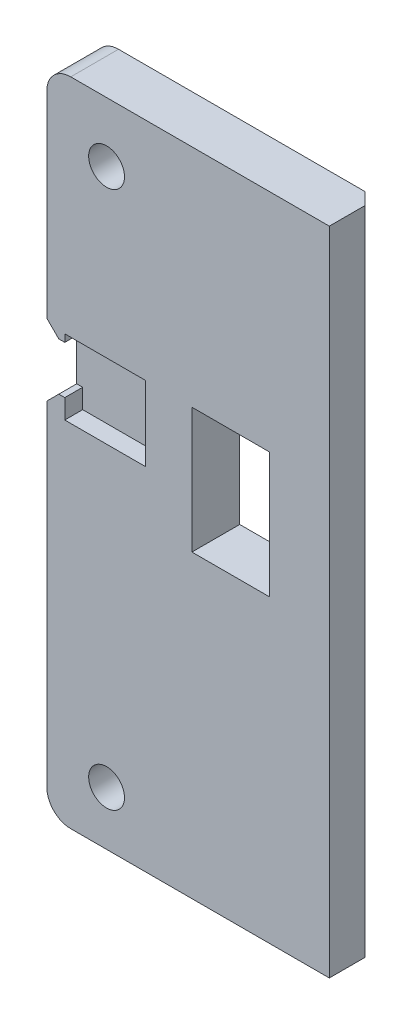
ISO-10303-21;
HEADER;
FILE_DESCRIPTION(('STEP AP214'),'2;1');
FILE_NAME('part.step','',(''),(''),'','','');
FILE_SCHEMA(('AUTOMOTIVE_DESIGN { 1 0 10303 214 1 1 1 1 }'));
ENDSEC;
DATA;
#1=APPLICATION_CONTEXT('core data for automotive mechanical design processes');
#2=APPLICATION_PROTOCOL_DEFINITION('international standard','automotive_design',2000,#1);
#3=PRODUCT_CONTEXT('',#1,'mechanical');
#4=PRODUCT('Part','Part','',(#3));
#5=PRODUCT_RELATED_PRODUCT_CATEGORY('part','',(#4));
#6=PRODUCT_DEFINITION_FORMATION('','',#4);
#7=PRODUCT_DEFINITION_CONTEXT('part definition',#1,'design');
#8=PRODUCT_DEFINITION('design','',#6,#7);
#9=PRODUCT_DEFINITION_SHAPE('','',#8);
#10=(LENGTH_UNIT() NAMED_UNIT(*) SI_UNIT(.MILLI.,.METRE.));
#11=(NAMED_UNIT(*) PLANE_ANGLE_UNIT() SI_UNIT($,.RADIAN.));
#12=(NAMED_UNIT(*) SI_UNIT($,.STERADIAN.) SOLID_ANGLE_UNIT());
#13=UNCERTAINTY_MEASURE_WITH_UNIT(LENGTH_MEASURE(1.E-05),#10,'distance_accuracy_value','');
#14=(GEOMETRIC_REPRESENTATION_CONTEXT(3) GLOBAL_UNCERTAINTY_ASSIGNED_CONTEXT((#13)) GLOBAL_UNIT_ASSIGNED_CONTEXT((#10,
#11,#12)) REPRESENTATION_CONTEXT('',''));
#15=CARTESIAN_POINT('',(0.,0.,0.));
#16=DIRECTION('',(0.,0.,1.));
#17=DIRECTION('',(1.,0.,0.));
#18=AXIS2_PLACEMENT_3D('',#15,#16,#17);
#19=CARTESIAN_POINT('',(0.,-4.59608864521565E-12,206.98943109955));
#20=DIRECTION('',(0.,0.,1.));
#21=DIRECTION('',(0.,-1.,0.));
#22=AXIS2_PLACEMENT_3D('',#19,#20,#21);
#23=PLANE('',#22);
#24=CARTESIAN_POINT('',(-770.850538245302,88.8586835195321,206.989431099552));
#25=DIRECTION('',(0.,0.,-1.));
#26=DIRECTION('',(0.,1.,0.));
#27=AXIS2_PLACEMENT_3D('',#24,#25,#26);
#28=CIRCLE('',#27,3.00000000000006);
#29=CARTESIAN_POINT('',(-770.850538245302,91.8586835195322,206.989431099552));
#30=VERTEX_POINT('',#29);
#31=EDGE_CURVE('E233',#30,#30,#28,.T.);
#32=ORIENTED_EDGE('',*,*,#31,.T.);
#33=EDGE_LOOP('',(#32));
#34=FACE_BOUND('',#33,.T.);
#35=DIRECTION('',(1.,0.,0.));
#36=VECTOR('',#35,1.);
#37=CARTESIAN_POINT('',(-777.850538245303,51.858683519532,206.989431099551));
#38=LINE('',#37,#36);
#39=CARTESIAN_POINT('',(-778.850538245303,51.858683519532,206.989431099551));
#40=VERTEX_POINT('',#39);
#41=CARTESIAN_POINT('',(-777.850538245303,51.858683519532,206.989431099551));
#42=VERTEX_POINT('',#41);
#43=EDGE_CURVE('E277',#40,#42,#38,.T.);
#44=ORIENTED_EDGE('',*,*,#43,.F.);
#45=DIRECTION('',(0.70710678118655,0.707106781186545,0.));
#46=VECTOR('',#45,1.);
#47=CARTESIAN_POINT('',(-415.354610882417,415.354610882416,206.989431099559));
#48=LINE('',#47,#46);
#49=CARTESIAN_POINT('',(-780.850538245303,49.858683519532,206.989431099551));
#50=VERTEX_POINT('',#49);
#51=EDGE_CURVE('E339',#40,#50,#48,.F.);
#52=ORIENTED_EDGE('',*,*,#51,.T.);
#53=DIRECTION('',(0.,1.,0.));
#54=VECTOR('',#53,1.);
#55=CARTESIAN_POINT('',(-780.850538245303,51.858683519532,206.989431099551));
#56=LINE('',#55,#54);
#57=CARTESIAN_POINT('',(-780.850538245303,-6.14131648046806,206.98943109955));
#58=VERTEX_POINT('',#57);
#59=EDGE_CURVE('E275',#58,#50,#56,.T.);
#60=ORIENTED_EDGE('',*,*,#59,.F.);
#61=CARTESIAN_POINT('',(-776.850538245303,-6.14131648046806,206.98943109955));
#62=DIRECTION('',(0.,0.,1.));
#63=DIRECTION('',(0.,-1.,0.));
#64=AXIS2_PLACEMENT_3D('',#61,#62,#63);
#65=CIRCLE('',#64,4.);
#66=CARTESIAN_POINT('',(-776.850538245303,-10.1413164804681,206.98943109955));
#67=VERTEX_POINT('',#66);
#68=EDGE_CURVE('E308',#58,#67,#65,.T.);
#69=ORIENTED_EDGE('',*,*,#68,.T.);
#70=DIRECTION('',(-1.,0.,0.));
#71=VECTOR('',#70,1.);
#72=CARTESIAN_POINT('',(-780.850538245303,-10.141316480468,206.98943109955));
#73=LINE('',#72,#71);
#74=CARTESIAN_POINT('',(-733.563818780292,-10.1413164804684,206.98943109955));
#75=VERTEX_POINT('',#74);
#76=EDGE_CURVE('E272',#75,#67,#73,.T.);
#77=ORIENTED_EDGE('',*,*,#76,.F.);
#78=DIRECTION('',(0.,-1.,0.));
#79=VECTOR('',#78,1.);
#80=CARTESIAN_POINT('',(-733.563818780292,-10.1413164804684,206.98943109955));
#81=LINE('',#80,#79);
#82=CARTESIAN_POINT('',(-733.563818780292,98.8586835195316,206.989431099552));
#83=VERTEX_POINT('',#82);
#84=EDGE_CURVE('E269',#83,#75,#81,.T.);
#85=ORIENTED_EDGE('',*,*,#84,.F.);
#86=DIRECTION('',(1.,0.,0.));
#87=VECTOR('',#86,1.);
#88=CARTESIAN_POINT('',(-733.563818780292,98.8586835195316,206.989431099552));
#89=LINE('',#88,#87);
#90=CARTESIAN_POINT('',(-776.850538245303,98.8586835195322,206.989431099552));
#91=VERTEX_POINT('',#90);
#92=EDGE_CURVE('E266',#91,#83,#89,.T.);
#93=ORIENTED_EDGE('',*,*,#92,.F.);
#94=CARTESIAN_POINT('',(-776.850538245303,94.8586835195322,206.989431099552));
#95=DIRECTION('',(0.,0.,1.));
#96=DIRECTION('',(0.,-1.,0.));
#97=AXIS2_PLACEMENT_3D('',#94,#95,#96);
#98=CIRCLE('',#97,4.);
#99=CARTESIAN_POINT('',(-780.850538245302,94.8586835195322,206.989431099552));
#100=VERTEX_POINT('',#99);
#101=EDGE_CURVE('E310',#91,#100,#98,.T.);
#102=ORIENTED_EDGE('',*,*,#101,.T.);
#103=DIRECTION('',(0.,1.,0.));
#104=VECTOR('',#103,1.);
#105=CARTESIAN_POINT('',(-780.850538245303,59.858683519532,206.989431099551));
#106=LINE('',#105,#104);
#107=CARTESIAN_POINT('',(-780.850538245303,61.858683519532,206.989431099551));
#108=VERTEX_POINT('',#107);
#109=EDGE_CURVE('E264',#108,#100,#106,.T.);
#110=ORIENTED_EDGE('',*,*,#109,.F.);
#111=DIRECTION('',(-0.70710678118655,0.707106781186545,0.));
#112=VECTOR('',#111,1.);
#113=CARTESIAN_POINT('',(-359.495927362881,-359.495927362888,206.989431099542));
#114=LINE('',#113,#112);
#115=CARTESIAN_POINT('',(-778.850538245303,59.858683519532,206.989431099551));
#116=VERTEX_POINT('',#115);
#117=EDGE_CURVE('E337',#108,#116,#114,.F.);
#118=ORIENTED_EDGE('',*,*,#117,.T.);
#119=DIRECTION('',(-1.,0.,0.));
#120=VECTOR('',#119,1.);
#121=CARTESIAN_POINT('',(-777.850538245303,59.858683519532,206.989431099551));
#122=LINE('',#121,#120);
#123=CARTESIAN_POINT('',(-777.850538245303,59.858683519532,206.989431099551));
#124=VERTEX_POINT('',#123);
#125=EDGE_CURVE('E262',#124,#116,#122,.T.);
#126=ORIENTED_EDGE('',*,*,#125,.F.);
#127=DIRECTION('',(0.,-1.,0.));
#128=VECTOR('',#127,1.);
#129=CARTESIAN_POINT('',(-777.850538245303,61.108683519532,206.989431099551));
#130=LINE('',#129,#128);
#131=CARTESIAN_POINT('',(-777.850538245303,61.108683519532,206.989431099551));
#132=VERTEX_POINT('',#131);
#133=EDGE_CURVE('E260',#132,#124,#130,.T.);
#134=ORIENTED_EDGE('',*,*,#133,.F.);
#135=DIRECTION('',(-1.,0.,0.));
#136=VECTOR('',#135,1.);
#137=CARTESIAN_POINT('',(-764.350538245303,61.108683519532,206.989431099551));
#138=LINE('',#137,#136);
#139=CARTESIAN_POINT('',(-764.350538245303,61.108683519532,206.989431099551));
#140=VERTEX_POINT('',#139);
#141=EDGE_CURVE('E236',#140,#132,#138,.T.);
#142=ORIENTED_EDGE('',*,*,#141,.F.);
#143=DIRECTION('',(0.,1.,0.));
#144=VECTOR('',#143,1.);
#145=CARTESIAN_POINT('',(-764.350538245303,61.108683519532,206.989431099551));
#146=LINE('',#145,#144);
#147=CARTESIAN_POINT('',(-764.350538245303,48.608683519532,206.989431099551));
#148=VERTEX_POINT('',#147);
#149=EDGE_CURVE('E241',#148,#140,#146,.T.);
#150=ORIENTED_EDGE('',*,*,#149,.F.);
#151=DIRECTION('',(1.,0.,0.));
#152=VECTOR('',#151,1.);
#153=CARTESIAN_POINT('',(-764.350538245303,48.608683519532,206.989431099551));
#154=LINE('',#153,#152);
#155=CARTESIAN_POINT('',(-777.850538245303,48.608683519532,206.989431099551));
#156=VERTEX_POINT('',#155);
#157=EDGE_CURVE('E281',#156,#148,#154,.T.);
#158=ORIENTED_EDGE('',*,*,#157,.F.);
#159=DIRECTION('',(0.,-1.,0.));
#160=VECTOR('',#159,1.);
#161=CARTESIAN_POINT('',(-777.850538245303,48.608683519532,206.989431099551));
#162=LINE('',#161,#160);
#163=EDGE_CURVE('E279',#42,#156,#162,.T.);
#164=ORIENTED_EDGE('',*,*,#163,.F.);
#165=EDGE_LOOP('',(#44,#52,#60,#69,#77,#85,#93,#102,#110,#118,#126,#134,#142,#150,#158,#164));
#166=FACE_BOUND('',#165,.T.);
#167=CARTESIAN_POINT('',(-770.850538245303,-1.14131648046788,206.98943109955));
#168=DIRECTION('',(0.,0.,-1.));
#169=DIRECTION('',(0.,1.,0.));
#170=AXIS2_PLACEMENT_3D('',#167,#168,#169);
#171=CIRCLE('',#170,3.00000000000005);
#172=CARTESIAN_POINT('',(-770.850538245303,1.85868351953217,206.98943109955));
#173=VERTEX_POINT('',#172);
#174=EDGE_CURVE('E189',#173,#173,#171,.T.);
#175=ORIENTED_EDGE('',*,*,#174,.T.);
#176=EDGE_LOOP('',(#175));
#177=FACE_BOUND('',#176,.T.);
#178=DIRECTION('',(-1.,0.,0.));
#179=VECTOR('',#178,1.);
#180=CARTESIAN_POINT('',(-756.563818780292,40.108683519532,206.989431099551));
#181=LINE('',#180,#179);
#182=CARTESIAN_POINT('',(-743.563818780292,40.108683519532,206.989431099551));
#183=VERTEX_POINT('',#182);
#184=CARTESIAN_POINT('',(-756.563818780292,40.108683519532,206.989431099551));
#185=VERTEX_POINT('',#184);
#186=EDGE_CURVE('E224',#183,#185,#181,.T.);
#187=ORIENTED_EDGE('',*,*,#186,.T.);
#188=DIRECTION('',(0.,1.,0.));
#189=VECTOR('',#188,1.);
#190=CARTESIAN_POINT('',(-756.563818780292,61.108683519532,206.989431099551));
#191=LINE('',#190,#189);
#192=CARTESIAN_POINT('',(-756.563818780292,61.108683519532,206.989431099551));
#193=VERTEX_POINT('',#192);
#194=EDGE_CURVE('E218',#185,#193,#191,.T.);
#195=ORIENTED_EDGE('',*,*,#194,.T.);
#196=DIRECTION('',(1.,0.,0.));
#197=VECTOR('',#196,1.);
#198=CARTESIAN_POINT('',(-743.563818780292,61.108683519532,206.989431099551));
#199=LINE('',#198,#197);
#200=CARTESIAN_POINT('',(-743.563818780292,61.108683519532,206.989431099551));
#201=VERTEX_POINT('',#200);
#202=EDGE_CURVE('E186',#193,#201,#199,.T.);
#203=ORIENTED_EDGE('',*,*,#202,.T.);
#204=DIRECTION('',(0.,-1.,0.));
#205=VECTOR('',#204,1.);
#206=CARTESIAN_POINT('',(-743.563818780292,40.108683519532,206.989431099551));
#207=LINE('',#206,#205);
#208=EDGE_CURVE('E221',#201,#183,#207,.T.);
#209=ORIENTED_EDGE('',*,*,#208,.T.);
#210=EDGE_LOOP('',(#187,#195,#203,#209));
#211=FACE_BOUND('',#210,.T.);
#212=ADVANCED_FACE('F33',(#34,#166,#177,#211),#23,.T.);
#213=CARTESIAN_POINT('',(-764.350538245303,61.1086835195321,203.989431099551));
#214=DIRECTION('',(0.,1.,0.));
#215=DIRECTION('',(0.,0.,1.));
#216=AXIS2_PLACEMENT_3D('',#213,#214,#215);
#217=PLANE('',#216);
#218=ORIENTED_EDGE('',*,*,#141,.T.);
#219=DIRECTION('',(0.,0.,1.));
#220=VECTOR('',#219,1.);
#221=CARTESIAN_POINT('',(-777.850538245303,61.1086835195321,203.989431099551));
#222=LINE('',#221,#220);
#223=CARTESIAN_POINT('',(-777.850538245303,61.1086835195321,203.989431099551));
#224=VERTEX_POINT('',#223);
#225=EDGE_CURVE('E302',#224,#132,#222,.T.);
#226=ORIENTED_EDGE('',*,*,#225,.F.);
#227=DIRECTION('',(-1.,0.,0.));
#228=VECTOR('',#227,1.);
#229=CARTESIAN_POINT('',(-764.350538245303,61.1086835195321,203.989431099551));
#230=LINE('',#229,#228);
#231=CARTESIAN_POINT('',(-764.350538245303,61.1086835195321,203.989431099551));
#232=VERTEX_POINT('',#231);
#233=EDGE_CURVE('E237',#232,#224,#230,.T.);
#234=ORIENTED_EDGE('',*,*,#233,.F.);
#235=DIRECTION('',(0.,0.,1.));
#236=VECTOR('',#235,1.);
#237=CARTESIAN_POINT('',(-764.350538245303,61.1086835195321,203.989431099551));
#238=LINE('',#237,#236);
#239=EDGE_CURVE('E257',#232,#140,#238,.T.);
#240=ORIENTED_EDGE('',*,*,#239,.T.);
#241=EDGE_LOOP('',(#218,#226,#234,#240));
#242=FACE_BOUND('',#241,.T.);
#243=ADVANCED_FACE('F379',(#242),#217,.F.);
#244=CARTESIAN_POINT('',(-777.850538245303,61.1086835195321,203.989431099551));
#245=DIRECTION('',(-1.,0.,0.));
#246=DIRECTION('',(0.,0.,1.));
#247=AXIS2_PLACEMENT_3D('',#244,#245,#246);
#248=PLANE('',#247);
#249=ORIENTED_EDGE('',*,*,#133,.T.);
#250=DIRECTION('',(0.,0.,1.));
#251=VECTOR('',#250,1.);
#252=CARTESIAN_POINT('',(-777.850538245303,59.8586835195321,203.989431099551));
#253=LINE('',#252,#251);
#254=CARTESIAN_POINT('',(-777.850538245303,59.8586835195321,203.989431099551));
#255=VERTEX_POINT('',#254);
#256=EDGE_CURVE('E299',#255,#124,#253,.T.);
#257=ORIENTED_EDGE('',*,*,#256,.F.);
#258=DIRECTION('',(0.,-1.,0.));
#259=VECTOR('',#258,1.);
#260=CARTESIAN_POINT('',(-777.850538245303,61.1086835195321,203.989431099551));
#261=LINE('',#260,#259);
#262=EDGE_CURVE('E240',#224,#255,#261,.T.);
#263=ORIENTED_EDGE('',*,*,#262,.F.);
#264=ORIENTED_EDGE('',*,*,#225,.T.);
#265=EDGE_LOOP('',(#249,#257,#263,#264));
#266=FACE_BOUND('',#265,.T.);
#267=ADVANCED_FACE('F438',(#266),#248,.F.);
#268=CARTESIAN_POINT('',(-777.850538245303,59.8586835195321,203.989431099551));
#269=DIRECTION('',(0.,1.,0.));
#270=DIRECTION('',(0.,0.,1.));
#271=AXIS2_PLACEMENT_3D('',#268,#269,#270);
#272=PLANE('',#271);
#273=ORIENTED_EDGE('',*,*,#125,.T.);
#274=DIRECTION('',(0.,0.,-1.));
#275=VECTOR('',#274,1.);
#276=CARTESIAN_POINT('',(-778.850538245303,59.8586835195321,203.989431099551));
#277=LINE('',#276,#275);
#278=CARTESIAN_POINT('',(-778.850538245303,59.8586835195321,203.989431099551));
#279=VERTEX_POINT('',#278);
#280=EDGE_CURVE('E48',#116,#279,#277,.T.);
#281=ORIENTED_EDGE('',*,*,#280,.T.);
#282=DIRECTION('',(-1.,0.,0.));
#283=VECTOR('',#282,1.);
#284=CARTESIAN_POINT('',(-777.850538245303,59.8586835195321,203.989431099551));
#285=LINE('',#284,#283);
#286=EDGE_CURVE('E244',#255,#279,#285,.T.);
#287=ORIENTED_EDGE('',*,*,#286,.F.);
#288=ORIENTED_EDGE('',*,*,#256,.T.);
#289=EDGE_LOOP('',(#273,#281,#287,#288));
#290=FACE_BOUND('',#289,.T.);
#291=ADVANCED_FACE('F434',(#290),#272,.F.);
#292=CARTESIAN_POINT('',(-733.563818780292,98.8586835195317,203.989431099552));
#293=DIRECTION('',(0.,-1.,0.));
#294=DIRECTION('',(0.,0.,-1.));
#295=AXIS2_PLACEMENT_3D('',#292,#293,#294);
#296=PLANE('',#295);
#297=DIRECTION('',(0.,0.,1.));
#298=VECTOR('',#297,1.);
#299=CARTESIAN_POINT('',(-733.563818780292,98.8586835195317,203.989431099552));
#300=LINE('',#299,#298);
#301=CARTESIAN_POINT('',(-733.563818780292,98.8586835195318,200.989431099552));
#302=VERTEX_POINT('',#301);
#303=EDGE_CURVE('E297',#302,#83,#300,.T.);
#304=ORIENTED_EDGE('',*,*,#303,.F.);
#305=DIRECTION('',(-0.707106781186551,0.,-0.707106781186544));
#306=VECTOR('',#305,1.);
#307=CARTESIAN_POINT('',(-735.563818780291,98.8586835195319,198.989431099553));
#308=LINE('',#307,#306);
#309=CARTESIAN_POINT('',(-735.563818780292,98.8586835195318,198.989431099552));
#310=VERTEX_POINT('',#309);
#311=EDGE_CURVE('E332',#302,#310,#308,.T.);
#312=ORIENTED_EDGE('',*,*,#311,.T.);
#313=DIRECTION('',(1.,0.,0.));
#314=VECTOR('',#313,1.);
#315=CARTESIAN_POINT('',(-780.850538245302,98.8586835195325,198.989431099552));
#316=LINE('',#315,#314);
#317=CARTESIAN_POINT('',(-776.850538245303,98.8586835195324,198.989431099552));
#318=VERTEX_POINT('',#317);
#319=EDGE_CURVE('E215',#318,#310,#316,.T.);
#320=ORIENTED_EDGE('',*,*,#319,.F.);
#321=DIRECTION('',(0.,0.,1.));
#322=VECTOR('',#321,1.);
#323=CARTESIAN_POINT('',(-776.850538245303,98.8586835195323,203.989431099552));
#324=LINE('',#323,#322);
#325=EDGE_CURVE('E305',#318,#91,#324,.T.);
#326=ORIENTED_EDGE('',*,*,#325,.T.);
#327=ORIENTED_EDGE('',*,*,#92,.T.);
#328=EDGE_LOOP('',(#304,#312,#320,#326,#327));
#329=FACE_BOUND('',#328,.T.);
#330=ADVANCED_FACE('F430',(#329),#296,.F.);
#331=CARTESIAN_POINT('',(-733.563818780292,-10.1413164804683,203.98943109955));
#332=DIRECTION('',(-1.,0.,0.));
#333=DIRECTION('',(0.,-1.,0.));
#334=AXIS2_PLACEMENT_3D('',#331,#332,#333);
#335=PLANE('',#334);
#336=DIRECTION('',(0.,0.,1.));
#337=VECTOR('',#336,1.);
#338=CARTESIAN_POINT('',(-733.563818780292,-10.1413164804683,203.98943109955));
#339=LINE('',#338,#337);
#340=CARTESIAN_POINT('',(-733.563818780292,-10.1413164804682,200.98943109955));
#341=VERTEX_POINT('',#340);
#342=EDGE_CURVE('E295',#341,#75,#339,.T.);
#343=ORIENTED_EDGE('',*,*,#342,.F.);
#344=DIRECTION('',(0.,1.,0.));
#345=VECTOR('',#344,1.);
#346=CARTESIAN_POINT('',(-733.563818780292,98.8586835195318,200.989431099552));
#347=LINE('',#346,#345);
#348=EDGE_CURVE('E330',#341,#302,#347,.T.);
#349=ORIENTED_EDGE('',*,*,#348,.T.);
#350=ORIENTED_EDGE('',*,*,#303,.T.);
#351=ORIENTED_EDGE('',*,*,#84,.T.);
#352=EDGE_LOOP('',(#343,#349,#350,#351));
#353=FACE_BOUND('',#352,.T.);
#354=ADVANCED_FACE('F426',(#353),#335,.F.);
#355=CARTESIAN_POINT('',(-780.850538245303,-10.141316480468,203.98943109955));
#356=DIRECTION('',(0.,1.,0.));
#357=DIRECTION('',(0.,0.,1.));
#358=AXIS2_PLACEMENT_3D('',#355,#356,#357);
#359=PLANE('',#358);
#360=DIRECTION('',(-1.,0.,0.));
#361=VECTOR('',#360,1.);
#362=CARTESIAN_POINT('',(-733.563818780292,-10.1413164804682,198.98943109955));
#363=LINE('',#362,#361);
#364=CARTESIAN_POINT('',(-735.563818780292,-10.1413164804682,198.98943109955));
#365=VERTEX_POINT('',#364);
#366=CARTESIAN_POINT('',(-776.850538245303,-10.1413164804679,198.98943109955));
#367=VERTEX_POINT('',#366);
#368=EDGE_CURVE('E210',#365,#367,#363,.T.);
#369=ORIENTED_EDGE('',*,*,#368,.F.);
#370=DIRECTION('',(0.707106781186551,0.,0.707106781186544));
#371=VECTOR('',#370,1.);
#372=CARTESIAN_POINT('',(-735.563818780292,-10.1413164804682,198.98943109955));
#373=LINE('',#372,#371);
#374=EDGE_CURVE('E328',#365,#341,#373,.T.);
#375=ORIENTED_EDGE('',*,*,#374,.T.);
#376=ORIENTED_EDGE('',*,*,#342,.T.);
#377=ORIENTED_EDGE('',*,*,#76,.T.);
#378=DIRECTION('',(0.,0.,1.));
#379=VECTOR('',#378,1.);
#380=CARTESIAN_POINT('',(-776.850538245303,-10.141316480468,203.98943109955));
#381=LINE('',#380,#379);
#382=EDGE_CURVE('E322',#67,#367,#381,.F.);
#383=ORIENTED_EDGE('',*,*,#382,.T.);
#384=EDGE_LOOP('',(#369,#375,#376,#377,#383));
#385=FACE_BOUND('',#384,.T.);
#386=ADVANCED_FACE('F423',(#385),#359,.F.);
#387=CARTESIAN_POINT('',(-780.850538245303,51.8586835195321,203.989431099551));
#388=DIRECTION('',(1.,0.,0.));
#389=DIRECTION('',(0.,0.,-1.));
#390=AXIS2_PLACEMENT_3D('',#387,#388,#389);
#391=PLANE('',#390);
#392=ORIENTED_EDGE('',*,*,#59,.T.);
#393=DIRECTION('',(0.,0.,-1.));
#394=VECTOR('',#393,1.);
#395=CARTESIAN_POINT('',(-780.850538245303,49.8586835195321,203.989431099551));
#396=LINE('',#395,#394);
#397=CARTESIAN_POINT('',(-780.850538245303,49.8586835195321,201.989431099551));
#398=VERTEX_POINT('',#397);
#399=EDGE_CURVE('E56',#50,#398,#396,.T.);
#400=ORIENTED_EDGE('',*,*,#399,.T.);
#401=DIRECTION('',(0.,1.,0.));
#402=VECTOR('',#401,1.);
#403=CARTESIAN_POINT('',(-780.850538245303,51.8586835195321,201.989431099551));
#404=LINE('',#403,#402);
#405=CARTESIAN_POINT('',(-780.850538245303,61.8586835195321,201.989431099551));
#406=VERTEX_POINT('',#405);
#407=EDGE_CURVE('E343',#398,#406,#404,.T.);
#408=ORIENTED_EDGE('',*,*,#407,.T.);
#409=DIRECTION('',(0.,0.,1.));
#410=VECTOR('',#409,1.);
#411=CARTESIAN_POINT('',(-780.850538245303,61.8586835195321,203.989431099551));
#412=LINE('',#411,#410);
#413=EDGE_CURVE('E341',#406,#108,#412,.T.);
#414=ORIENTED_EDGE('',*,*,#413,.T.);
#415=ORIENTED_EDGE('',*,*,#109,.T.);
#416=DIRECTION('',(0.,0.,1.));
#417=VECTOR('',#416,1.);
#418=CARTESIAN_POINT('',(-780.850538245303,94.8586835195323,203.989431099552));
#419=LINE('',#418,#417);
#420=CARTESIAN_POINT('',(-780.850538245302,94.8586835195324,198.989431099552));
#421=VERTEX_POINT('',#420);
#422=EDGE_CURVE('E316',#100,#421,#419,.F.);
#423=ORIENTED_EDGE('',*,*,#422,.T.);
#424=DIRECTION('',(0.,1.,0.));
#425=VECTOR('',#424,1.);
#426=CARTESIAN_POINT('',(-780.850538245303,-10.1413164804678,198.98943109955));
#427=LINE('',#426,#425);
#428=CARTESIAN_POINT('',(-780.850538245303,-6.14131648046786,198.98943109955));
#429=VERTEX_POINT('',#428);
#430=EDGE_CURVE('E212',#429,#421,#427,.T.);
#431=ORIENTED_EDGE('',*,*,#430,.F.);
#432=DIRECTION('',(0.,0.,1.));
#433=VECTOR('',#432,1.);
#434=CARTESIAN_POINT('',(-780.850538245303,-6.14131648046799,203.98943109955));
#435=LINE('',#434,#433);
#436=EDGE_CURVE('E313',#429,#58,#435,.T.);
#437=ORIENTED_EDGE('',*,*,#436,.T.);
#438=EDGE_LOOP('',(#392,#400,#408,#414,#415,#423,#431,#437));
#439=FACE_BOUND('',#438,.T.);
#440=ADVANCED_FACE('F419',(#439),#391,.F.);
#441=CARTESIAN_POINT('',(-777.850538245303,51.8586835195321,203.989431099551));
#442=DIRECTION('',(0.,-1.,0.));
#443=DIRECTION('',(0.,0.,-1.));
#444=AXIS2_PLACEMENT_3D('',#441,#442,#443);
#445=PLANE('',#444);
#446=DIRECTION('',(1.,0.,0.));
#447=VECTOR('',#446,1.);
#448=CARTESIAN_POINT('',(-778.850538245303,51.8586835195321,203.989431099551));
#449=LINE('',#448,#447);
#450=CARTESIAN_POINT('',(-778.850538245303,51.8586835195321,203.989431099551));
#451=VERTEX_POINT('',#450);
#452=CARTESIAN_POINT('',(-777.850538245303,51.8586835195321,203.989431099551));
#453=VERTEX_POINT('',#452);
#454=EDGE_CURVE('E246',#451,#453,#449,.T.);
#455=ORIENTED_EDGE('',*,*,#454,.F.);
#456=DIRECTION('',(0.,0.,1.));
#457=VECTOR('',#456,1.);
#458=CARTESIAN_POINT('',(-778.850538245303,51.8586835195321,203.989431099551));
#459=LINE('',#458,#457);
#460=EDGE_CURVE('E334',#451,#40,#459,.T.);
#461=ORIENTED_EDGE('',*,*,#460,.T.);
#462=ORIENTED_EDGE('',*,*,#43,.T.);
#463=DIRECTION('',(0.,0.,1.));
#464=VECTOR('',#463,1.);
#465=CARTESIAN_POINT('',(-777.850538245303,51.8586835195321,203.989431099551));
#466=LINE('',#465,#464);
#467=EDGE_CURVE('E292',#453,#42,#466,.T.);
#468=ORIENTED_EDGE('',*,*,#467,.F.);
#469=EDGE_LOOP('',(#455,#461,#462,#468));
#470=FACE_BOUND('',#469,.T.);
#471=ADVANCED_FACE('F415',(#470),#445,.F.);
#472=CARTESIAN_POINT('',(-777.850538245303,48.6086835195321,203.989431099551));
#473=DIRECTION('',(-1.,0.,0.));
#474=DIRECTION('',(0.,0.,1.));
#475=AXIS2_PLACEMENT_3D('',#472,#473,#474);
#476=PLANE('',#475);
#477=ORIENTED_EDGE('',*,*,#163,.T.);
#478=DIRECTION('',(0.,0.,1.));
#479=VECTOR('',#478,1.);
#480=CARTESIAN_POINT('',(-777.850538245303,48.6086835195321,203.989431099551));
#481=LINE('',#480,#479);
#482=CARTESIAN_POINT('',(-777.850538245303,48.6086835195321,203.989431099551));
#483=VERTEX_POINT('',#482);
#484=EDGE_CURVE('E289',#483,#156,#481,.T.);
#485=ORIENTED_EDGE('',*,*,#484,.F.);
#486=DIRECTION('',(0.,-1.,0.));
#487=VECTOR('',#486,1.);
#488=CARTESIAN_POINT('',(-777.850538245303,48.6086835195321,203.989431099551));
#489=LINE('',#488,#487);
#490=EDGE_CURVE('E248',#453,#483,#489,.T.);
#491=ORIENTED_EDGE('',*,*,#490,.F.);
#492=ORIENTED_EDGE('',*,*,#467,.T.);
#493=EDGE_LOOP('',(#477,#485,#491,#492));
#494=FACE_BOUND('',#493,.T.);
#495=ADVANCED_FACE('F411',(#494),#476,.F.);
#496=CARTESIAN_POINT('',(-764.350538245303,48.6086835195321,203.989431099551));
#497=DIRECTION('',(0.,-1.,0.));
#498=DIRECTION('',(0.,0.,-1.));
#499=AXIS2_PLACEMENT_3D('',#496,#497,#498);
#500=PLANE('',#499);
#501=ORIENTED_EDGE('',*,*,#157,.T.);
#502=DIRECTION('',(0.,0.,1.));
#503=VECTOR('',#502,1.);
#504=CARTESIAN_POINT('',(-764.350538245303,48.6086835195321,203.989431099551));
#505=LINE('',#504,#503);
#506=CARTESIAN_POINT('',(-764.350538245303,48.6086835195321,203.989431099551));
#507=VERTEX_POINT('',#506);
#508=EDGE_CURVE('E286',#507,#148,#505,.T.);
#509=ORIENTED_EDGE('',*,*,#508,.F.);
#510=DIRECTION('',(1.,0.,0.));
#511=VECTOR('',#510,1.);
#512=CARTESIAN_POINT('',(-764.350538245303,48.6086835195321,203.989431099551));
#513=LINE('',#512,#511);
#514=EDGE_CURVE('E251',#483,#507,#513,.T.);
#515=ORIENTED_EDGE('',*,*,#514,.F.);
#516=ORIENTED_EDGE('',*,*,#484,.T.);
#517=EDGE_LOOP('',(#501,#509,#515,#516));
#518=FACE_BOUND('',#517,.T.);
#519=ADVANCED_FACE('F407',(#518),#500,.F.);
#520=CARTESIAN_POINT('',(-764.350538245303,61.1086835195321,203.989431099551));
#521=DIRECTION('',(1.,0.,0.));
#522=DIRECTION('',(0.,0.,-1.));
#523=AXIS2_PLACEMENT_3D('',#520,#521,#522);
#524=PLANE('',#523);
#525=ORIENTED_EDGE('',*,*,#149,.T.);
#526=ORIENTED_EDGE('',*,*,#239,.F.);
#527=DIRECTION('',(0.,1.,0.));
#528=VECTOR('',#527,1.);
#529=CARTESIAN_POINT('',(-764.350538245303,61.1086835195321,203.989431099551));
#530=LINE('',#529,#528);
#531=EDGE_CURVE('E254',#507,#232,#530,.T.);
#532=ORIENTED_EDGE('',*,*,#531,.F.);
#533=ORIENTED_EDGE('',*,*,#508,.T.);
#534=EDGE_LOOP('',(#525,#526,#532,#533));
#535=FACE_BOUND('',#534,.T.);
#536=ADVANCED_FACE('F402',(#535),#524,.F.);
#537=CARTESIAN_POINT('',(-770.850538245302,88.8586835195322,203.989431099552));
#538=DIRECTION('',(0.,0.,1.));
#539=DIRECTION('',(0.,-1.,0.));
#540=AXIS2_PLACEMENT_3D('',#537,#538,#539);
#541=CYLINDRICAL_SURFACE('',#540,3.00000000000006);
#542=CARTESIAN_POINT('',(-770.850538245302,88.8586835195323,200.989431099552));
#543=DIRECTION('',(0.,0.,-1.));
#544=DIRECTION('',(0.,1.,0.));
#545=AXIS2_PLACEMENT_3D('',#542,#543,#544);
#546=CIRCLE('',#545,3.00000000000006);
#547=CARTESIAN_POINT('',(-770.850538245302,91.8586835195323,200.989431099552));
#548=VERTEX_POINT('',#547);
#549=EDGE_CURVE('E11',#548,#548,#546,.T.);
#550=ORIENTED_EDGE('',*,*,#549,.T.);
#551=EDGE_LOOP('',(#550));
#552=FACE_BOUND('',#551,.T.);
#553=ORIENTED_EDGE('',*,*,#31,.F.);
#554=EDGE_LOOP('',(#553));
#555=FACE_BOUND('',#554,.T.);
#556=ADVANCED_FACE('F373',(#552,#555),#541,.F.);
#557=CARTESIAN_POINT('',(-770.850538245303,-1.14131648046781,203.98943109955));
#558=DIRECTION('',(0.,0.,1.));
#559=DIRECTION('',(0.,-1.,0.));
#560=AXIS2_PLACEMENT_3D('',#557,#558,#559);
#561=CYLINDRICAL_SURFACE('',#560,3.00000000000005);
#562=CARTESIAN_POINT('',(-770.850538245303,-1.14131648046773,200.98943109955));
#563=DIRECTION('',(0.,0.,-1.));
#564=DIRECTION('',(0.,1.,0.));
#565=AXIS2_PLACEMENT_3D('',#562,#563,#564);
#566=CIRCLE('',#565,3.00000000000005);
#567=CARTESIAN_POINT('',(-770.850538245303,1.85868351953232,200.98943109955));
#568=VERTEX_POINT('',#567);
#569=EDGE_CURVE('E349',#568,#568,#566,.T.);
#570=ORIENTED_EDGE('',*,*,#569,.T.);
#571=EDGE_LOOP('',(#570));
#572=FACE_BOUND('',#571,.T.);
#573=ORIENTED_EDGE('',*,*,#174,.F.);
#574=EDGE_LOOP('',(#573));
#575=FACE_BOUND('',#574,.T.);
#576=ADVANCED_FACE('F370',(#572,#575),#561,.F.);
#577=CARTESIAN_POINT('',(-756.563818780292,61.1086835195321,203.989431099551));
#578=DIRECTION('',(1.,0.,0.));
#579=DIRECTION('',(0.,0.,-1.));
#580=AXIS2_PLACEMENT_3D('',#577,#578,#579);
#581=PLANE('',#580);
#582=ORIENTED_EDGE('',*,*,#194,.F.);
#583=DIRECTION('',(0.,0.,1.));
#584=VECTOR('',#583,1.);
#585=CARTESIAN_POINT('',(-756.563818780292,40.1086835195321,203.989431099551));
#586=LINE('',#585,#584);
#587=CARTESIAN_POINT('',(-756.563818780292,40.1086835195322,198.989431099551));
#588=VERTEX_POINT('',#587);
#589=EDGE_CURVE('E196',#588,#185,#586,.T.);
#590=ORIENTED_EDGE('',*,*,#589,.F.);
#591=DIRECTION('',(0.,1.,0.));
#592=VECTOR('',#591,1.);
#593=CARTESIAN_POINT('',(-756.563818780292,40.1086835195322,198.989431099551));
#594=LINE('',#593,#592);
#595=CARTESIAN_POINT('',(-756.563818780292,61.1086835195322,198.989431099551));
#596=VERTEX_POINT('',#595);
#597=EDGE_CURVE('E193',#588,#596,#594,.T.);
#598=ORIENTED_EDGE('',*,*,#597,.T.);
#599=DIRECTION('',(0.,0.,1.));
#600=VECTOR('',#599,1.);
#601=CARTESIAN_POINT('',(-756.563818780292,61.1086835195321,203.989431099551));
#602=LINE('',#601,#600);
#603=EDGE_CURVE('E179',#596,#193,#602,.T.);
#604=ORIENTED_EDGE('',*,*,#603,.T.);
#605=EDGE_LOOP('',(#582,#590,#598,#604));
#606=FACE_BOUND('',#605,.T.);
#607=ADVANCED_FACE('F194',(#606),#581,.T.);
#608=CARTESIAN_POINT('',(-743.563818780292,61.1086835195321,203.989431099551));
#609=DIRECTION('',(0.,-1.,0.));
#610=DIRECTION('',(0.,0.,-1.));
#611=AXIS2_PLACEMENT_3D('',#608,#609,#610);
#612=PLANE('',#611);
#613=ORIENTED_EDGE('',*,*,#202,.F.);
#614=ORIENTED_EDGE('',*,*,#603,.F.);
#615=DIRECTION('',(1.,0.,0.));
#616=VECTOR('',#615,1.);
#617=CARTESIAN_POINT('',(-756.563818780292,61.1086835195322,198.989431099551));
#618=LINE('',#617,#616);
#619=CARTESIAN_POINT('',(-743.563818780292,61.1086835195322,198.989431099551));
#620=VERTEX_POINT('',#619);
#621=EDGE_CURVE('E183',#596,#620,#618,.T.);
#622=ORIENTED_EDGE('',*,*,#621,.T.);
#623=DIRECTION('',(0.,0.,1.));
#624=VECTOR('',#623,1.);
#625=CARTESIAN_POINT('',(-743.563818780292,61.1086835195321,203.989431099551));
#626=LINE('',#625,#624);
#627=EDGE_CURVE('E190',#620,#201,#626,.T.);
#628=ORIENTED_EDGE('',*,*,#627,.T.);
#629=EDGE_LOOP('',(#613,#614,#622,#628));
#630=FACE_BOUND('',#629,.T.);
#631=ADVANCED_FACE('F181',(#630),#612,.T.);
#632=CARTESIAN_POINT('',(-743.563818780292,40.1086835195321,203.989431099551));
#633=DIRECTION('',(-1.,0.,0.));
#634=DIRECTION('',(0.,0.,1.));
#635=AXIS2_PLACEMENT_3D('',#632,#633,#634);
#636=PLANE('',#635);
#637=ORIENTED_EDGE('',*,*,#208,.F.);
#638=ORIENTED_EDGE('',*,*,#627,.F.);
#639=DIRECTION('',(0.,-1.,0.));
#640=VECTOR('',#639,1.);
#641=CARTESIAN_POINT('',(-743.563818780292,61.1086835195322,198.989431099551));
#642=LINE('',#641,#640);
#643=CARTESIAN_POINT('',(-743.563818780292,40.1086835195322,198.989431099551));
#644=VERTEX_POINT('',#643);
#645=EDGE_CURVE('E204',#620,#644,#642,.T.);
#646=ORIENTED_EDGE('',*,*,#645,.T.);
#647=DIRECTION('',(0.,0.,1.));
#648=VECTOR('',#647,1.);
#649=CARTESIAN_POINT('',(-743.563818780292,40.1086835195321,203.989431099551));
#650=LINE('',#649,#648);
#651=EDGE_CURVE('E228',#644,#183,#650,.T.);
#652=ORIENTED_EDGE('',*,*,#651,.T.);
#653=EDGE_LOOP('',(#637,#638,#646,#652));
#654=FACE_BOUND('',#653,.T.);
#655=ADVANCED_FACE('F387',(#654),#636,.T.);
#656=CARTESIAN_POINT('',(-756.563818780292,40.1086835195321,203.989431099551));
#657=DIRECTION('',(0.,1.,0.));
#658=DIRECTION('',(0.,0.,1.));
#659=AXIS2_PLACEMENT_3D('',#656,#657,#658);
#660=PLANE('',#659);
#661=ORIENTED_EDGE('',*,*,#186,.F.);
#662=ORIENTED_EDGE('',*,*,#651,.F.);
#663=DIRECTION('',(-1.,0.,0.));
#664=VECTOR('',#663,1.);
#665=CARTESIAN_POINT('',(-743.563818780292,40.1086835195322,198.989431099551));
#666=LINE('',#665,#664);
#667=EDGE_CURVE('E206',#644,#588,#666,.T.);
#668=ORIENTED_EDGE('',*,*,#667,.T.);
#669=ORIENTED_EDGE('',*,*,#589,.T.);
#670=EDGE_LOOP('',(#661,#662,#668,#669));
#671=FACE_BOUND('',#670,.T.);
#672=ADVANCED_FACE('F385',(#671),#660,.T.);
#673=CARTESIAN_POINT('',(0.,-4.5190865590048E-12,203.98943109955));
#674=DIRECTION('',(0.,0.,-1.));
#675=DIRECTION('',(0.,1.,0.));
#676=AXIS2_PLACEMENT_3D('',#673,#674,#675);
#677=PLANE('',#676);
#678=ORIENTED_EDGE('',*,*,#286,.T.);
#679=DIRECTION('',(0.,-1.,0.));
#680=VECTOR('',#679,1.);
#681=CARTESIAN_POINT('',(-778.850538245303,-4.5190865590048E-12,203.98943109955));
#682=LINE('',#681,#680);
#683=EDGE_CURVE('E346',#279,#451,#682,.T.);
#684=ORIENTED_EDGE('',*,*,#683,.T.);
#685=ORIENTED_EDGE('',*,*,#454,.T.);
#686=ORIENTED_EDGE('',*,*,#490,.T.);
#687=ORIENTED_EDGE('',*,*,#514,.T.);
#688=ORIENTED_EDGE('',*,*,#531,.T.);
#689=ORIENTED_EDGE('',*,*,#233,.T.);
#690=ORIENTED_EDGE('',*,*,#262,.T.);
#691=EDGE_LOOP('',(#678,#684,#685,#686,#687,#688,#689,#690));
#692=FACE_BOUND('',#691,.T.);
#693=ADVANCED_FACE('F394',(#692),#677,.F.);
#694=CARTESIAN_POINT('',(0.,-4.40806425654229E-12,198.98943109955));
#695=DIRECTION('',(0.,0.,-1.));
#696=DIRECTION('',(0.,1.,0.));
#697=AXIS2_PLACEMENT_3D('',#694,#695,#696);
#698=PLANE('',#697);
#699=CARTESIAN_POINT('',(-770.850538245303,-1.14131648046769,198.98943109955));
#700=DIRECTION('',(0.,0.,-1.));
#701=DIRECTION('',(0.,1.,0.));
#702=AXIS2_PLACEMENT_3D('',#699,#700,#701);
#703=CIRCLE('',#702,5.00000000000005);
#704=CARTESIAN_POINT('',(-770.850538245303,3.85868351953236,198.98943109955));
#705=VERTEX_POINT('',#704);
#706=EDGE_CURVE('E41',#705,#705,#703,.F.);
#707=ORIENTED_EDGE('',*,*,#706,.T.);
#708=EDGE_LOOP('',(#707));
#709=FACE_BOUND('',#708,.T.);
#710=CARTESIAN_POINT('',(-770.850538245302,88.8586835195323,198.989431099552));
#711=DIRECTION('',(0.,0.,-1.));
#712=DIRECTION('',(0.,1.,0.));
#713=AXIS2_PLACEMENT_3D('',#710,#711,#712);
#714=CIRCLE('',#713,5.00000000000006);
#715=CARTESIAN_POINT('',(-770.850538245302,93.8586835195324,198.989431099552));
#716=VERTEX_POINT('',#715);
#717=EDGE_CURVE('E357',#716,#716,#714,.F.);
#718=ORIENTED_EDGE('',*,*,#717,.T.);
#719=EDGE_LOOP('',(#718));
#720=FACE_BOUND('',#719,.T.);
#721=ORIENTED_EDGE('',*,*,#319,.T.);
#722=DIRECTION('',(0.,-1.,0.));
#723=VECTOR('',#722,1.);
#724=CARTESIAN_POINT('',(-735.563818780292,-10.1413164804682,198.98943109955));
#725=LINE('',#724,#723);
#726=EDGE_CURVE('E325',#310,#365,#725,.T.);
#727=ORIENTED_EDGE('',*,*,#726,.T.);
#728=ORIENTED_EDGE('',*,*,#368,.T.);
#729=CARTESIAN_POINT('',(-776.850538245303,-6.14131648046786,198.98943109955));
#730=DIRECTION('',(0.,0.,-1.));
#731=DIRECTION('',(0.,1.,0.));
#732=AXIS2_PLACEMENT_3D('',#729,#730,#731);
#733=CIRCLE('',#732,4.);
#734=EDGE_CURVE('E318',#367,#429,#733,.T.);
#735=ORIENTED_EDGE('',*,*,#734,.T.);
#736=ORIENTED_EDGE('',*,*,#430,.T.);
#737=CARTESIAN_POINT('',(-776.850538245303,94.8586835195324,198.989431099552));
#738=DIRECTION('',(0.,0.,-1.));
#739=DIRECTION('',(0.,1.,0.));
#740=AXIS2_PLACEMENT_3D('',#737,#738,#739);
#741=CIRCLE('',#740,4.);
#742=EDGE_CURVE('E320',#421,#318,#741,.T.);
#743=ORIENTED_EDGE('',*,*,#742,.T.);
#744=EDGE_LOOP('',(#721,#727,#728,#735,#736,#743));
#745=FACE_BOUND('',#744,.T.);
#746=ORIENTED_EDGE('',*,*,#621,.F.);
#747=ORIENTED_EDGE('',*,*,#597,.F.);
#748=ORIENTED_EDGE('',*,*,#667,.F.);
#749=ORIENTED_EDGE('',*,*,#645,.F.);
#750=EDGE_LOOP('',(#746,#747,#748,#749));
#751=FACE_BOUND('',#750,.T.);
#752=ADVANCED_FACE('F202',(#709,#720,#745,#751),#698,.T.);
#753=CARTESIAN_POINT('',(-776.850538245303,94.8586835195323,203.989431099552));
#754=DIRECTION('',(0.,0.,1.));
#755=DIRECTION('',(0.,-1.,0.));
#756=AXIS2_PLACEMENT_3D('',#753,#754,#755);
#757=CYLINDRICAL_SURFACE('',#756,4.);
#758=ORIENTED_EDGE('',*,*,#742,.F.);
#759=ORIENTED_EDGE('',*,*,#422,.F.);
#760=ORIENTED_EDGE('',*,*,#101,.F.);
#761=ORIENTED_EDGE('',*,*,#325,.F.);
#762=EDGE_LOOP('',(#758,#759,#760,#761));
#763=FACE_BOUND('',#762,.T.);
#764=ADVANCED_FACE('F445',(#763),#757,.T.);
#765=CARTESIAN_POINT('',(-776.850538245303,-6.14131648046799,203.98943109955));
#766=DIRECTION('',(0.,0.,1.));
#767=DIRECTION('',(0.,-1.,0.));
#768=AXIS2_PLACEMENT_3D('',#765,#766,#767);
#769=CYLINDRICAL_SURFACE('',#768,4.);
#770=ORIENTED_EDGE('',*,*,#734,.F.);
#771=ORIENTED_EDGE('',*,*,#382,.F.);
#772=ORIENTED_EDGE('',*,*,#68,.F.);
#773=ORIENTED_EDGE('',*,*,#436,.F.);
#774=EDGE_LOOP('',(#770,#771,#772,#773));
#775=FACE_BOUND('',#774,.T.);
#776=ADVANCED_FACE('F448',(#775),#769,.T.);
#777=CARTESIAN_POINT('',(-735.563818780292,-2.90964244426506E-12,198.98943109955));
#778=DIRECTION('',(0.707106781186544,0.,-0.707106781186551));
#779=DIRECTION('',(0.,1.,0.));
#780=AXIS2_PLACEMENT_3D('',#777,#778,#779);
#781=PLANE('',#780);
#782=ORIENTED_EDGE('',*,*,#311,.F.);
#783=ORIENTED_EDGE('',*,*,#348,.F.);
#784=ORIENTED_EDGE('',*,*,#374,.F.);
#785=ORIENTED_EDGE('',*,*,#726,.F.);
#786=EDGE_LOOP('',(#782,#783,#784,#785));
#787=FACE_BOUND('',#786,.T.);
#788=ADVANCED_FACE('F452',(#787),#781,.T.);
#789=CARTESIAN_POINT('',(-780.850538245303,61.8586835195321,203.989431099551));
#790=DIRECTION('',(0.707106781186545,0.70710678118655,0.));
#791=DIRECTION('',(0.,0.,1.));
#792=AXIS2_PLACEMENT_3D('',#789,#790,#791);
#793=PLANE('',#792);
#794=ORIENTED_EDGE('',*,*,#117,.F.);
#795=ORIENTED_EDGE('',*,*,#413,.F.);
#796=DIRECTION('',(0.577350269189628,-0.577350269189639,0.57735026918961));
#797=VECTOR('',#796,1.);
#798=CARTESIAN_POINT('',(-777.51720491197,58.5253501861987,205.322764432885));
#799=LINE('',#798,#797);
#800=EDGE_CURVE('E200',#279,#406,#799,.F.);
#801=ORIENTED_EDGE('',*,*,#800,.F.);
#802=ORIENTED_EDGE('',*,*,#280,.F.);
#803=EDGE_LOOP('',(#794,#795,#801,#802));
#804=FACE_BOUND('',#803,.T.);
#805=ADVANCED_FACE('F456',(#804),#793,.F.);
#806=CARTESIAN_POINT('',(-780.850538245303,51.8586835195321,201.989431099551));
#807=DIRECTION('',(0.707106781186544,0.,-0.70710678118655));
#808=DIRECTION('',(0.,1.,0.));
#809=AXIS2_PLACEMENT_3D('',#806,#807,#808);
#810=PLANE('',#809);
#811=ORIENTED_EDGE('',*,*,#800,.T.);
#812=ORIENTED_EDGE('',*,*,#407,.F.);
#813=DIRECTION('',(0.577350269189629,0.577350269189611,0.577350269189637));
#814=VECTOR('',#813,1.);
#815=CARTESIAN_POINT('',(-778.850538245303,51.8586835195321,203.989431099551));
#816=LINE('',#815,#814);
#817=EDGE_CURVE('E350',#451,#398,#816,.F.);
#818=ORIENTED_EDGE('',*,*,#817,.F.);
#819=ORIENTED_EDGE('',*,*,#683,.F.);
#820=EDGE_LOOP('',(#811,#812,#818,#819));
#821=FACE_BOUND('',#820,.T.);
#822=ADVANCED_FACE('F460',(#821),#810,.F.);
#823=CARTESIAN_POINT('',(-778.850538245303,51.8586835195321,203.989431099551));
#824=DIRECTION('',(0.707106781186545,-0.70710678118655,0.));
#825=DIRECTION('',(0.,0.,1.));
#826=AXIS2_PLACEMENT_3D('',#823,#824,#825);
#827=PLANE('',#826);
#828=ORIENTED_EDGE('',*,*,#817,.T.);
#829=ORIENTED_EDGE('',*,*,#399,.F.);
#830=ORIENTED_EDGE('',*,*,#51,.F.);
#831=ORIENTED_EDGE('',*,*,#460,.F.);
#832=EDGE_LOOP('',(#828,#829,#830,#831));
#833=FACE_BOUND('',#832,.T.);
#834=ADVANCED_FACE('F367',(#833),#827,.F.);
#835=CARTESIAN_POINT('',(-770.850538245303,-1.14131648046773,200.98943109955));
#836=DIRECTION('',(0.,0.,-1.));
#837=DIRECTION('',(0.,1.,0.));
#838=AXIS2_PLACEMENT_3D('',#835,#836,#837);
#839=TOROIDAL_SURFACE('',#838,5.00000000000005,2.);
#840=ORIENTED_EDGE('',*,*,#706,.F.);
#841=EDGE_LOOP('',(#840));
#842=FACE_BOUND('',#841,.T.);
#843=ORIENTED_EDGE('',*,*,#569,.F.);
#844=EDGE_LOOP('',(#843));
#845=FACE_BOUND('',#844,.T.);
#846=ADVANCED_FACE('F364',(#842,#845),#839,.T.);
#847=CARTESIAN_POINT('',(-770.850538245302,88.8586835195323,200.989431099552));
#848=DIRECTION('',(0.,0.,-1.));
#849=DIRECTION('',(0.,1.,0.));
#850=AXIS2_PLACEMENT_3D('',#847,#848,#849);
#851=TOROIDAL_SURFACE('',#850,5.00000000000006,2.);
#852=ORIENTED_EDGE('',*,*,#717,.F.);
#853=EDGE_LOOP('',(#852));
#854=FACE_BOUND('',#853,.T.);
#855=ORIENTED_EDGE('',*,*,#549,.F.);
#856=EDGE_LOOP('',(#855));
#857=FACE_BOUND('',#856,.T.);
#858=ADVANCED_FACE('F35',(#854,#857),#851,.T.);
#859=CLOSED_SHELL('',(#212,#243,#267,#291,#330,#354,#386,#440,#471,#495,#519,#536,#556,#576,
#607,#631,#655,#672,#693,#752,#764,#776,#788,#805,#822,#834,#846,#858));
#860=MANIFOLD_SOLID_BREP('B2',#859);
#861=ADVANCED_BREP_SHAPE_REPRESENTATION('',(#18,#860),#14);
#862=SHAPE_DEFINITION_REPRESENTATION(#9,#861);
ENDSEC;
END-ISO-10303-21;
